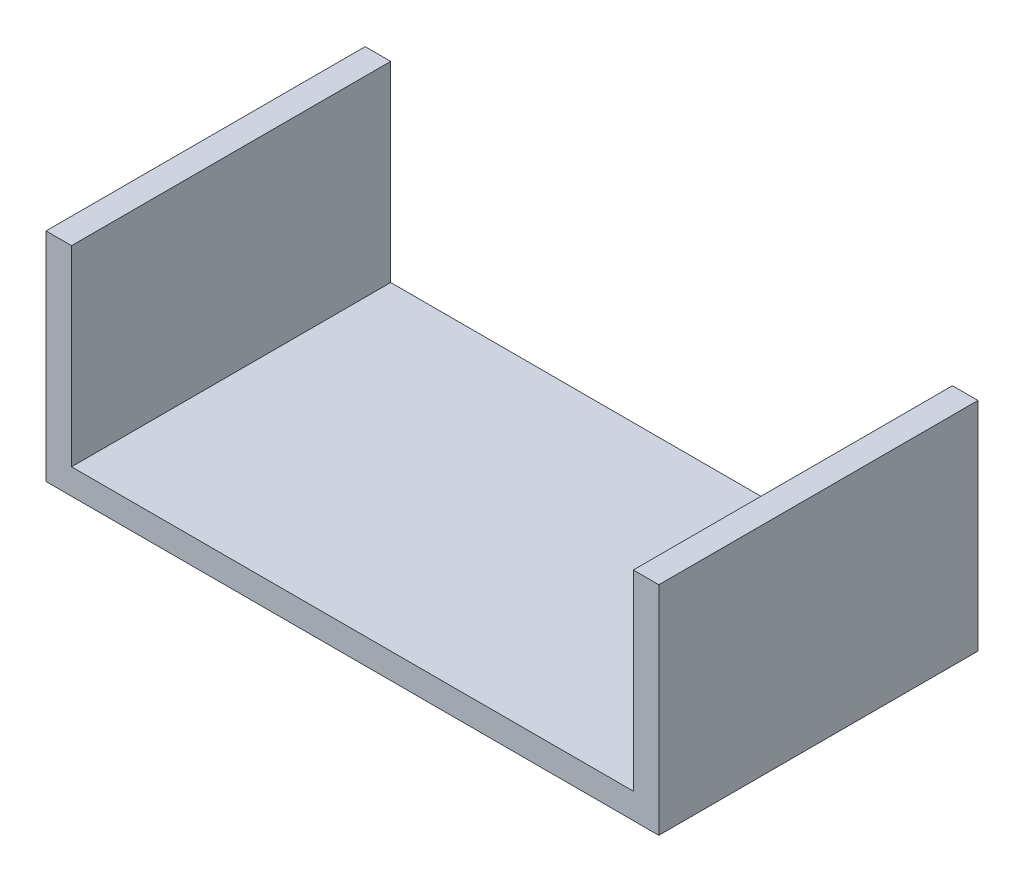
ISO-10303-21;
HEADER;
FILE_DESCRIPTION(('STEP AP214'),'2;1');
FILE_NAME('part.step','',(''),(''),'','','');
FILE_SCHEMA(('AUTOMOTIVE_DESIGN { 1 0 10303 214 1 1 1 1 }'));
ENDSEC;
DATA;
#1=APPLICATION_CONTEXT('core data for automotive mechanical design processes');
#2=APPLICATION_PROTOCOL_DEFINITION('international standard','automotive_design',2000,#1);
#3=PRODUCT_CONTEXT('',#1,'mechanical');
#4=PRODUCT('Part','Part','',(#3));
#5=PRODUCT_RELATED_PRODUCT_CATEGORY('part','',(#4));
#6=PRODUCT_DEFINITION_FORMATION('','',#4);
#7=PRODUCT_DEFINITION_CONTEXT('part definition',#1,'design');
#8=PRODUCT_DEFINITION('design','',#6,#7);
#9=PRODUCT_DEFINITION_SHAPE('','',#8);
#10=(LENGTH_UNIT() NAMED_UNIT(*) SI_UNIT(.MILLI.,.METRE.));
#11=(NAMED_UNIT(*) PLANE_ANGLE_UNIT() SI_UNIT($,.RADIAN.));
#12=(NAMED_UNIT(*) SI_UNIT($,.STERADIAN.) SOLID_ANGLE_UNIT());
#13=UNCERTAINTY_MEASURE_WITH_UNIT(LENGTH_MEASURE(1.E-05),#10,'distance_accuracy_value','');
#14=(GEOMETRIC_REPRESENTATION_CONTEXT(3) GLOBAL_UNCERTAINTY_ASSIGNED_CONTEXT((#13)) GLOBAL_UNIT_ASSIGNED_CONTEXT((#10,
#11,#12)) REPRESENTATION_CONTEXT('',''));
#15=CARTESIAN_POINT('',(0.,0.,0.));
#16=DIRECTION('',(0.,0.,1.));
#17=DIRECTION('',(1.,0.,0.));
#18=AXIS2_PLACEMENT_3D('',#15,#16,#17);
#19=CARTESIAN_POINT('',(0.,8.5,0.));
#20=DIRECTION('',(0.,-1.,0.));
#21=DIRECTION('',(0.,0.,-1.));
#22=AXIS2_PLACEMENT_3D('',#19,#20,#21);
#23=PLANE('',#22);
#24=DIRECTION('',(0.,0.,-1.));
#25=VECTOR('',#24,1.);
#26=CARTESIAN_POINT('',(22.,8.5,0.));
#27=LINE('',#26,#25);
#28=CARTESIAN_POINT('',(22.,8.5,12.5));
#29=VERTEX_POINT('',#28);
#30=CARTESIAN_POINT('',(22.,8.5,-12.5));
#31=VERTEX_POINT('',#30);
#32=EDGE_CURVE('E120',#29,#31,#27,.T.);
#33=ORIENTED_EDGE('',*,*,#32,.F.);
#34=DIRECTION('',(1.,0.,0.));
#35=VECTOR('',#34,1.);
#36=CARTESIAN_POINT('',(-24.,8.5,12.5));
#37=LINE('',#36,#35);
#38=CARTESIAN_POINT('',(24.,8.5,12.5));
#39=VERTEX_POINT('',#38);
#40=EDGE_CURVE('E63',#29,#39,#37,.T.);
#41=ORIENTED_EDGE('',*,*,#40,.T.);
#42=DIRECTION('',(0.,0.,-1.));
#43=VECTOR('',#42,1.);
#44=CARTESIAN_POINT('',(24.,8.5,12.5));
#45=LINE('',#44,#43);
#46=CARTESIAN_POINT('',(24.,8.5,-12.5));
#47=VERTEX_POINT('',#46);
#48=EDGE_CURVE('E146',#39,#47,#45,.T.);
#49=ORIENTED_EDGE('',*,*,#48,.T.);
#50=DIRECTION('',(-1.,0.,0.));
#51=VECTOR('',#50,1.);
#52=CARTESIAN_POINT('',(-24.,8.5,-12.5));
#53=LINE('',#52,#51);
#54=EDGE_CURVE('E92',#47,#31,#53,.T.);
#55=ORIENTED_EDGE('',*,*,#54,.T.);
#56=EDGE_LOOP('',(#33,#41,#49,#55));
#57=FACE_BOUND('',#56,.T.);
#58=ADVANCED_FACE('F39',(#57),#23,.F.);
#59=DIRECTION('',(0.,0.,1.));
#60=VECTOR('',#59,1.);
#61=CARTESIAN_POINT('',(-22.,8.5,0.));
#62=LINE('',#61,#60);
#63=CARTESIAN_POINT('',(-22.,8.5,-12.5));
#64=VERTEX_POINT('',#63);
#65=CARTESIAN_POINT('',(-22.,8.5,12.5));
#66=VERTEX_POINT('',#65);
#67=EDGE_CURVE('E138',#64,#66,#62,.T.);
#68=ORIENTED_EDGE('',*,*,#67,.F.);
#69=CARTESIAN_POINT('',(-24.,8.5,-12.5));
#70=VERTEX_POINT('',#69);
#71=EDGE_CURVE('E148',#64,#70,#53,.T.);
#72=ORIENTED_EDGE('',*,*,#71,.T.);
#73=DIRECTION('',(0.,0.,1.));
#74=VECTOR('',#73,1.);
#75=CARTESIAN_POINT('',(-24.,8.5,12.5));
#76=LINE('',#75,#74);
#77=CARTESIAN_POINT('',(-24.,8.5,12.5));
#78=VERTEX_POINT('',#77);
#79=EDGE_CURVE('E150',#70,#78,#76,.T.);
#80=ORIENTED_EDGE('',*,*,#79,.T.);
#81=EDGE_CURVE('E152',#78,#66,#37,.T.);
#82=ORIENTED_EDGE('',*,*,#81,.T.);
#83=EDGE_LOOP('',(#68,#72,#80,#82));
#84=FACE_BOUND('',#83,.T.);
#85=ADVANCED_FACE('F181',(#84),#23,.F.);
#86=CARTESIAN_POINT('',(24.,8.5,12.5));
#87=DIRECTION('',(-1.,0.,0.));
#88=DIRECTION('',(0.,0.,1.));
#89=AXIS2_PLACEMENT_3D('',#86,#87,#88);
#90=PLANE('',#89);
#91=DIRECTION('',(0.,0.,-1.));
#92=VECTOR('',#91,1.);
#93=CARTESIAN_POINT('',(24.,-8.5,12.5));
#94=LINE('',#93,#92);
#95=CARTESIAN_POINT('',(24.,-8.5,12.5));
#96=VERTEX_POINT('',#95);
#97=CARTESIAN_POINT('',(24.,-8.5,-12.5));
#98=VERTEX_POINT('',#97);
#99=EDGE_CURVE('E122',#96,#98,#94,.T.);
#100=ORIENTED_EDGE('',*,*,#99,.T.);
#101=DIRECTION('',(0.,-1.,0.));
#102=VECTOR('',#101,1.);
#103=CARTESIAN_POINT('',(24.,8.5,-12.5));
#104=LINE('',#103,#102);
#105=EDGE_CURVE('E11',#47,#98,#104,.T.);
#106=ORIENTED_EDGE('',*,*,#105,.F.);
#107=ORIENTED_EDGE('',*,*,#48,.F.);
#108=DIRECTION('',(0.,-1.,0.));
#109=VECTOR('',#108,1.);
#110=CARTESIAN_POINT('',(24.,8.5,12.5));
#111=LINE('',#110,#109);
#112=EDGE_CURVE('E155',#39,#96,#111,.T.);
#113=ORIENTED_EDGE('',*,*,#112,.T.);
#114=EDGE_LOOP('',(#100,#106,#107,#113));
#115=FACE_BOUND('',#114,.T.);
#116=ADVANCED_FACE('F41',(#115),#90,.F.);
#117=CARTESIAN_POINT('',(-24.,8.5,-12.5));
#118=DIRECTION('',(0.,0.,1.));
#119=DIRECTION('',(1.,0.,0.));
#120=AXIS2_PLACEMENT_3D('',#117,#118,#119);
#121=PLANE('',#120);
#122=ORIENTED_EDGE('',*,*,#71,.F.);
#123=DIRECTION('',(0.,-1.,0.));
#124=VECTOR('',#123,1.);
#125=CARTESIAN_POINT('',(-22.,8.5,-12.5));
#126=LINE('',#125,#124);
#127=CARTESIAN_POINT('',(-22.,-6.5,-12.5));
#128=VERTEX_POINT('',#127);
#129=EDGE_CURVE('E54',#64,#128,#126,.T.);
#130=ORIENTED_EDGE('',*,*,#129,.T.);
#131=DIRECTION('',(-1.,0.,0.));
#132=VECTOR('',#131,1.);
#133=CARTESIAN_POINT('',(0.,-6.5,-12.5));
#134=LINE('',#133,#132);
#135=CARTESIAN_POINT('',(22.,-6.5,-12.5));
#136=VERTEX_POINT('',#135);
#137=EDGE_CURVE('E126',#136,#128,#134,.T.);
#138=ORIENTED_EDGE('',*,*,#137,.F.);
#139=DIRECTION('',(0.,-1.,0.));
#140=VECTOR('',#139,1.);
#141=CARTESIAN_POINT('',(22.,8.5,-12.5));
#142=LINE('',#141,#140);
#143=EDGE_CURVE('E115',#31,#136,#142,.T.);
#144=ORIENTED_EDGE('',*,*,#143,.F.);
#145=ORIENTED_EDGE('',*,*,#54,.F.);
#146=ORIENTED_EDGE('',*,*,#105,.T.);
#147=DIRECTION('',(-1.,0.,0.));
#148=VECTOR('',#147,1.);
#149=CARTESIAN_POINT('',(-24.,-8.5,-12.5));
#150=LINE('',#149,#148);
#151=CARTESIAN_POINT('',(-24.,-8.5,-12.5));
#152=VERTEX_POINT('',#151);
#153=EDGE_CURVE('E158',#98,#152,#150,.T.);
#154=ORIENTED_EDGE('',*,*,#153,.T.);
#155=DIRECTION('',(0.,-1.,0.));
#156=VECTOR('',#155,1.);
#157=CARTESIAN_POINT('',(-24.,8.5,-12.5));
#158=LINE('',#157,#156);
#159=EDGE_CURVE('E47',#70,#152,#158,.T.);
#160=ORIENTED_EDGE('',*,*,#159,.F.);
#161=EDGE_LOOP('',(#122,#130,#138,#144,#145,#146,#154,#160));
#162=FACE_BOUND('',#161,.T.);
#163=ADVANCED_FACE('F131',(#162),#121,.F.);
#164=CARTESIAN_POINT('',(-24.,8.5,12.5));
#165=DIRECTION('',(1.,0.,0.));
#166=DIRECTION('',(0.,0.,-1.));
#167=AXIS2_PLACEMENT_3D('',#164,#165,#166);
#168=PLANE('',#167);
#169=DIRECTION('',(0.,0.,1.));
#170=VECTOR('',#169,1.);
#171=CARTESIAN_POINT('',(-24.,-8.5,12.5));
#172=LINE('',#171,#170);
#173=CARTESIAN_POINT('',(-24.,-8.5,12.5));
#174=VERTEX_POINT('',#173);
#175=EDGE_CURVE('E160',#152,#174,#172,.T.);
#176=ORIENTED_EDGE('',*,*,#175,.T.);
#177=DIRECTION('',(0.,-1.,0.));
#178=VECTOR('',#177,1.);
#179=CARTESIAN_POINT('',(-24.,8.5,12.5));
#180=LINE('',#179,#178);
#181=EDGE_CURVE('E164',#78,#174,#180,.T.);
#182=ORIENTED_EDGE('',*,*,#181,.F.);
#183=ORIENTED_EDGE('',*,*,#79,.F.);
#184=ORIENTED_EDGE('',*,*,#159,.T.);
#185=EDGE_LOOP('',(#176,#182,#183,#184));
#186=FACE_BOUND('',#185,.T.);
#187=ADVANCED_FACE('F170',(#186),#168,.F.);
#188=CARTESIAN_POINT('',(-24.,8.5,12.5));
#189=DIRECTION('',(0.,0.,-1.));
#190=DIRECTION('',(-1.,0.,0.));
#191=AXIS2_PLACEMENT_3D('',#188,#189,#190);
#192=PLANE('',#191);
#193=ORIENTED_EDGE('',*,*,#40,.F.);
#194=DIRECTION('',(0.,-1.,0.));
#195=VECTOR('',#194,1.);
#196=CARTESIAN_POINT('',(22.,8.5,12.5));
#197=LINE('',#196,#195);
#198=CARTESIAN_POINT('',(22.,-6.5,12.5));
#199=VERTEX_POINT('',#198);
#200=EDGE_CURVE('E140',#29,#199,#197,.T.);
#201=ORIENTED_EDGE('',*,*,#200,.T.);
#202=DIRECTION('',(1.,0.,0.));
#203=VECTOR('',#202,1.);
#204=CARTESIAN_POINT('',(0.,-6.5,12.5));
#205=LINE('',#204,#203);
#206=CARTESIAN_POINT('',(-22.,-6.5,12.5));
#207=VERTEX_POINT('',#206);
#208=EDGE_CURVE('E128',#207,#199,#205,.T.);
#209=ORIENTED_EDGE('',*,*,#208,.F.);
#210=DIRECTION('',(0.,-1.,0.));
#211=VECTOR('',#210,1.);
#212=CARTESIAN_POINT('',(-22.,8.5,12.5));
#213=LINE('',#212,#211);
#214=EDGE_CURVE('E137',#66,#207,#213,.T.);
#215=ORIENTED_EDGE('',*,*,#214,.F.);
#216=ORIENTED_EDGE('',*,*,#81,.F.);
#217=ORIENTED_EDGE('',*,*,#181,.T.);
#218=DIRECTION('',(1.,0.,0.));
#219=VECTOR('',#218,1.);
#220=CARTESIAN_POINT('',(-24.,-8.5,12.5));
#221=LINE('',#220,#219);
#222=EDGE_CURVE('E85',#174,#96,#221,.T.);
#223=ORIENTED_EDGE('',*,*,#222,.T.);
#224=ORIENTED_EDGE('',*,*,#112,.F.);
#225=EDGE_LOOP('',(#193,#201,#209,#215,#216,#217,#223,#224));
#226=FACE_BOUND('',#225,.T.);
#227=ADVANCED_FACE('F178',(#226),#192,.F.);
#228=CARTESIAN_POINT('',(0.,-8.5,0.));
#229=DIRECTION('',(0.,-1.,0.));
#230=DIRECTION('',(0.,0.,-1.));
#231=AXIS2_PLACEMENT_3D('',#228,#229,#230);
#232=PLANE('',#231);
#233=ORIENTED_EDGE('',*,*,#99,.F.);
#234=ORIENTED_EDGE('',*,*,#222,.F.);
#235=ORIENTED_EDGE('',*,*,#175,.F.);
#236=ORIENTED_EDGE('',*,*,#153,.F.);
#237=EDGE_LOOP('',(#233,#234,#235,#236));
#238=FACE_BOUND('',#237,.T.);
#239=ADVANCED_FACE('F174',(#238),#232,.T.);
#240=CARTESIAN_POINT('',(22.,8.5,12.5));
#241=DIRECTION('',(-1.,0.,0.));
#242=DIRECTION('',(0.,0.,1.));
#243=AXIS2_PLACEMENT_3D('',#240,#241,#242);
#244=PLANE('',#243);
#245=DIRECTION('',(0.,0.,-1.));
#246=VECTOR('',#245,1.);
#247=CARTESIAN_POINT('',(22.,-6.5,0.));
#248=LINE('',#247,#246);
#249=EDGE_CURVE('E118',#199,#136,#248,.T.);
#250=ORIENTED_EDGE('',*,*,#249,.F.);
#251=ORIENTED_EDGE('',*,*,#200,.F.);
#252=ORIENTED_EDGE('',*,*,#32,.T.);
#253=ORIENTED_EDGE('',*,*,#143,.T.);
#254=EDGE_LOOP('',(#250,#251,#252,#253));
#255=FACE_BOUND('',#254,.T.);
#256=ADVANCED_FACE('F117',(#255),#244,.T.);
#257=CARTESIAN_POINT('',(-22.,8.5,12.5));
#258=DIRECTION('',(1.,0.,0.));
#259=DIRECTION('',(0.,0.,-1.));
#260=AXIS2_PLACEMENT_3D('',#257,#258,#259);
#261=PLANE('',#260);
#262=DIRECTION('',(0.,0.,1.));
#263=VECTOR('',#262,1.);
#264=CARTESIAN_POINT('',(-22.,-6.5,0.));
#265=LINE('',#264,#263);
#266=EDGE_CURVE('E132',#128,#207,#265,.T.);
#267=ORIENTED_EDGE('',*,*,#266,.F.);
#268=ORIENTED_EDGE('',*,*,#129,.F.);
#269=ORIENTED_EDGE('',*,*,#67,.T.);
#270=ORIENTED_EDGE('',*,*,#214,.T.);
#271=EDGE_LOOP('',(#267,#268,#269,#270));
#272=FACE_BOUND('',#271,.T.);
#273=ADVANCED_FACE('F234',(#272),#261,.T.);
#274=CARTESIAN_POINT('',(0.,-6.5,0.));
#275=DIRECTION('',(0.,-1.,0.));
#276=DIRECTION('',(0.,0.,-1.));
#277=AXIS2_PLACEMENT_3D('',#274,#275,#276);
#278=PLANE('',#277);
#279=ORIENTED_EDGE('',*,*,#249,.T.);
#280=ORIENTED_EDGE('',*,*,#137,.T.);
#281=ORIENTED_EDGE('',*,*,#266,.T.);
#282=ORIENTED_EDGE('',*,*,#208,.T.);
#283=EDGE_LOOP('',(#279,#280,#281,#282));
#284=FACE_BOUND('',#283,.T.);
#285=ADVANCED_FACE('F125',(#284),#278,.F.);
#286=CLOSED_SHELL('',(#58,#85,#116,#163,#187,#227,#239,#256,#273,#285));
#287=MANIFOLD_SOLID_BREP('B2',#286);
#288=ADVANCED_BREP_SHAPE_REPRESENTATION('',(#18,#287),#14);
#289=SHAPE_DEFINITION_REPRESENTATION(#9,#288);
ENDSEC;
END-ISO-10303-21;
